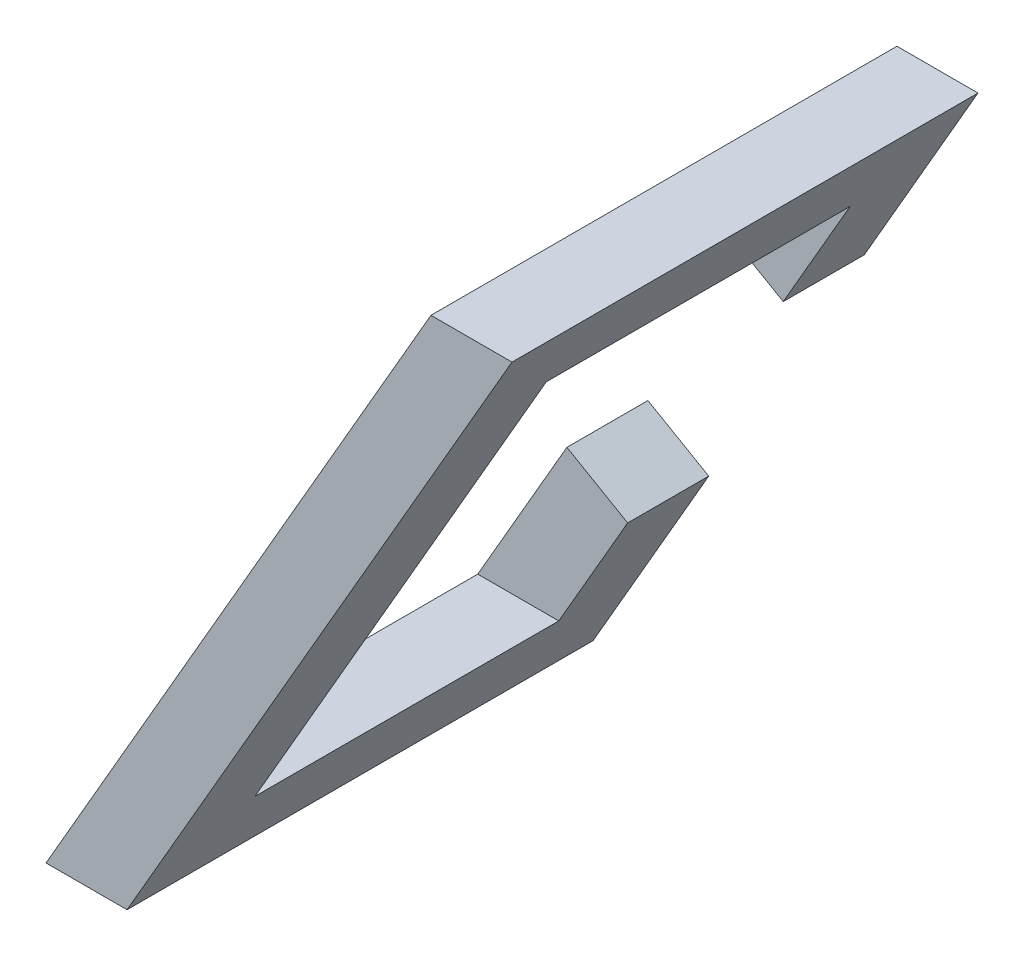
ISO-10303-21;
HEADER;
FILE_DESCRIPTION(('STEP AP214'),'2;1');
FILE_NAME('part.step','',(''),(''),'','','');
FILE_SCHEMA(('AUTOMOTIVE_DESIGN { 1 0 10303 214 1 1 1 1 }'));
ENDSEC;
DATA;
#1=APPLICATION_CONTEXT('core data for automotive mechanical design processes');
#2=APPLICATION_PROTOCOL_DEFINITION('international standard','automotive_design',2000,#1);
#3=PRODUCT_CONTEXT('',#1,'mechanical');
#4=PRODUCT('Part','Part','',(#3));
#5=PRODUCT_RELATED_PRODUCT_CATEGORY('part','',(#4));
#6=PRODUCT_DEFINITION_FORMATION('','',#4);
#7=PRODUCT_DEFINITION_CONTEXT('part definition',#1,'design');
#8=PRODUCT_DEFINITION('design','',#6,#7);
#9=PRODUCT_DEFINITION_SHAPE('','',#8);
#10=(LENGTH_UNIT() NAMED_UNIT(*) SI_UNIT(.MILLI.,.METRE.));
#11=(NAMED_UNIT(*) PLANE_ANGLE_UNIT() SI_UNIT($,.RADIAN.));
#12=(NAMED_UNIT(*) SI_UNIT($,.STERADIAN.) SOLID_ANGLE_UNIT());
#13=UNCERTAINTY_MEASURE_WITH_UNIT(LENGTH_MEASURE(1.E-05),#10,'distance_accuracy_value','');
#14=(GEOMETRIC_REPRESENTATION_CONTEXT(3) GLOBAL_UNCERTAINTY_ASSIGNED_CONTEXT((#13)) GLOBAL_UNIT_ASSIGNED_CONTEXT((#10,
#11,#12)) REPRESENTATION_CONTEXT('',''));
#15=CARTESIAN_POINT('',(0.,0.,0.));
#16=DIRECTION('',(0.,0.,1.));
#17=DIRECTION('',(1.,0.,0.));
#18=AXIS2_PLACEMENT_3D('',#15,#16,#17);
#19=CARTESIAN_POINT('',(4.58257569495584,0.,2.));
#20=DIRECTION('',(0.,0.,1.));
#21=DIRECTION('',(1.,0.,0.));
#22=AXIS2_PLACEMENT_3D('',#19,#20,#21);
#23=PLANE('',#22);
#24=DIRECTION('',(0.866025403784439,-0.5,0.));
#25=VECTOR('',#24,1.);
#26=CARTESIAN_POINT('',(5.3502578182624,54.1316550845719,2.));
#27=LINE('',#26,#25);
#28=CARTESIAN_POINT('',(73.2739783593554,14.915876745811,2.));
#29=VERTEX_POINT('',#28);
#30=CARTESIAN_POINT('',(76.2739783593554,13.1838259382421,2.));
#31=VERTEX_POINT('',#30);
#32=EDGE_CURVE('E144',#29,#31,#27,.T.);
#33=ORIENTED_EDGE('',*,*,#32,.F.);
#34=DIRECTION('',(-0.5,-0.866025403784439,0.));
#35=VECTOR('',#34,1.);
#36=CARTESIAN_POINT('',(85.5649607214573,36.2044826719044,2.));
#37=LINE('',#36,#35);
#38=CARTESIAN_POINT('',(68.8743617982158,7.2955173280957,2.));
#39=VERTEX_POINT('',#38);
#40=EDGE_CURVE('E48',#29,#39,#37,.T.);
#41=ORIENTED_EDGE('',*,*,#40,.T.);
#42=DIRECTION('',(-1.,0.,0.));
#43=VECTOR('',#42,1.);
#44=CARTESIAN_POINT('',(68.8743617982158,7.2955173280957,2.));
#45=LINE('',#44,#43);
#46=CARTESIAN_POINT('',(72.8743617982158,7.2955173280957,2.));
#47=VERTEX_POINT('',#46);
#48=EDGE_CURVE('E164',#47,#39,#45,.T.);
#49=ORIENTED_EDGE('',*,*,#48,.F.);
#50=DIRECTION('',(0.5,0.866025403784439,0.));
#51=VECTOR('',#50,1.);
#52=CARTESIAN_POINT('',(76.2255814313462,13.1,2.));
#53=LINE('',#52,#51);
#54=EDGE_CURVE('E209',#47,#31,#53,.T.);
#55=ORIENTED_EDGE('',*,*,#54,.T.);
#56=EDGE_LOOP('',(#33,#41,#49,#55));
#57=FACE_BOUND('',#56,.T.);
#58=ADVANCED_FACE('F33',(#57),#23,.T.);
#59=CARTESIAN_POINT('',(34.5825756949558,0.,-2.));
#60=DIRECTION('',(0.,0.,-1.));
#61=DIRECTION('',(-1.,0.,0.));
#62=AXIS2_PLACEMENT_3D('',#59,#60,#61);
#63=PLANE('',#62);
#64=DIRECTION('',(1.,0.,0.));
#65=VECTOR('',#64,1.);
#66=CARTESIAN_POINT('',(66.5649607214573,3.29551732809569,-2.));
#67=LINE('',#66,#65);
#68=CARTESIAN_POINT('',(66.5649607214573,3.29551732809569,-2.));
#69=VERTEX_POINT('',#68);
#70=CARTESIAN_POINT('',(70.5649607214573,3.29551732809569,-2.));
#71=VERTEX_POINT('',#70);
#72=EDGE_CURVE('E194',#69,#71,#67,.T.);
#73=ORIENTED_EDGE('',*,*,#72,.F.);
#74=DIRECTION('',(-0.5,-0.866025403784439,0.));
#75=VECTOR('',#74,1.);
#76=CARTESIAN_POINT('',(85.5649607214573,36.2044826719044,-2.));
#77=LINE('',#76,#75);
#78=CARTESIAN_POINT('',(73.2739783593554,14.915876745811,-2.00000000000001));
#79=VERTEX_POINT('',#78);
#80=EDGE_CURVE('E138',#79,#69,#77,.T.);
#81=ORIENTED_EDGE('',*,*,#80,.F.);
#82=DIRECTION('',(0.866025403784439,-0.5,0.));
#83=VECTOR('',#82,1.);
#84=CARTESIAN_POINT('',(67.613724321511,18.1838259382421,-2.00000000000001));
#85=LINE('',#84,#83);
#86=CARTESIAN_POINT('',(76.2739783593554,13.1838259382421,-2.00000000000001));
#87=VERTEX_POINT('',#86);
#88=EDGE_CURVE('E136',#79,#87,#85,.T.);
#89=ORIENTED_EDGE('',*,*,#88,.T.);
#90=DIRECTION('',(0.5,0.866025403784439,0.));
#91=VECTOR('',#90,1.);
#92=CARTESIAN_POINT('',(76.2255814313462,13.1,-2.));
#93=LINE('',#92,#91);
#94=EDGE_CURVE('E41',#71,#87,#93,.T.);
#95=ORIENTED_EDGE('',*,*,#94,.F.);
#96=EDGE_LOOP('',(#73,#81,#89,#95));
#97=FACE_BOUND('',#96,.T.);
#98=ADVANCED_FACE('F137',(#97),#63,.T.);
#99=CARTESIAN_POINT('',(5.3502578182624,54.1316550845719,-10.1));
#100=DIRECTION('',(-0.5,-0.866025403784439,0.));
#101=DIRECTION('',(0.866025403784439,-0.5,0.));
#102=AXIS2_PLACEMENT_3D('',#99,#100,#101);
#103=PLANE('',#102);
#104=DIRECTION('',(0.,0.,-1.));
#105=VECTOR('',#104,1.);
#106=CARTESIAN_POINT('',(76.2739783593554,13.1838259382421,-10.1));
#107=LINE('',#106,#105);
#108=EDGE_CURVE('E126',#31,#87,#107,.T.);
#109=ORIENTED_EDGE('',*,*,#108,.T.);
#110=ORIENTED_EDGE('',*,*,#88,.F.);
#111=DIRECTION('',(0.,0.,-1.));
#112=VECTOR('',#111,1.);
#113=CARTESIAN_POINT('',(73.2739783593554,14.915876745811,-10.1));
#114=LINE('',#113,#112);
#115=EDGE_CURVE('E140',#29,#79,#114,.T.);
#116=ORIENTED_EDGE('',*,*,#115,.F.);
#117=ORIENTED_EDGE('',*,*,#32,.T.);
#118=EDGE_LOOP('',(#109,#110,#116,#117));
#119=FACE_BOUND('',#118,.T.);
#120=ADVANCED_FACE('F142',(#119),#103,.F.);
#121=DIRECTION('',(0.866025403784439,-0.5,0.));
#122=VECTOR('',#121,1.);
#123=CARTESIAN_POINT('',(58.3929490320727,41.2407763670697,-2.00000000000001));
#124=LINE('',#123,#122);
#125=CARTESIAN_POINT('',(80.9527369395774,28.215876745811,-2.00000000000001));
#126=VERTEX_POINT('',#125);
#127=CARTESIAN_POINT('',(83.9527369395774,26.4838259382421,-2.00000000000001));
#128=VERTEX_POINT('',#127);
#129=EDGE_CURVE('E154',#126,#128,#124,.T.);
#130=ORIENTED_EDGE('',*,*,#129,.F.);
#131=CARTESIAN_POINT('',(85.5649607214573,36.2044826719044,-2.));
#132=VERTEX_POINT('',#131);
#133=EDGE_CURVE('E191',#132,#126,#77,.T.);
#134=ORIENTED_EDGE('',*,*,#133,.F.);
#135=DIRECTION('',(-1.,0.,0.));
#136=VECTOR('',#135,1.);
#137=CARTESIAN_POINT('',(85.5649607214573,36.2044826719044,-2.));
#138=LINE('',#137,#136);
#139=CARTESIAN_POINT('',(89.5649607214573,36.2044826719044,-2.));
#140=VERTEX_POINT('',#139);
#141=EDGE_CURVE('E196',#140,#132,#138,.T.);
#142=ORIENTED_EDGE('',*,*,#141,.F.);
#143=EDGE_CURVE('E133',#128,#140,#93,.T.);
#144=ORIENTED_EDGE('',*,*,#143,.F.);
#145=EDGE_LOOP('',(#130,#134,#142,#144));
#146=FACE_BOUND('',#145,.T.);
#147=ADVANCED_FACE('F230',(#146),#63,.T.);
#148=CARTESIAN_POINT('',(83.2555596446988,32.2044826719044,21.));
#149=DIRECTION('',(0.,1.,0.));
#150=DIRECTION('',(0.,0.,1.));
#151=AXIS2_PLACEMENT_3D('',#148,#149,#150);
#152=PLANE('',#151);
#153=DIRECTION('',(1.,0.,0.));
#154=VECTOR('',#153,1.);
#155=CARTESIAN_POINT('',(83.2555596446988,32.2044826719044,17.));
#156=LINE('',#155,#154);
#157=CARTESIAN_POINT('',(83.2555596446988,32.2044826719044,17.));
#158=VERTEX_POINT('',#157);
#159=CARTESIAN_POINT('',(87.2555596446987,32.2044826719044,17.));
#160=VERTEX_POINT('',#159);
#161=EDGE_CURVE('E162',#158,#160,#156,.T.);
#162=ORIENTED_EDGE('',*,*,#161,.F.);
#163=DIRECTION('',(0.,0.,-1.));
#164=VECTOR('',#163,1.);
#165=CARTESIAN_POINT('',(83.2555596446988,32.2044826719044,21.));
#166=LINE('',#165,#164);
#167=CARTESIAN_POINT('',(83.2555596446988,32.2044826719044,2.));
#168=VERTEX_POINT('',#167);
#169=EDGE_CURVE('E189',#158,#168,#166,.T.);
#170=ORIENTED_EDGE('',*,*,#169,.T.);
#171=DIRECTION('',(1.,0.,0.));
#172=VECTOR('',#171,1.);
#173=CARTESIAN_POINT('',(83.2555596446988,32.2044826719044,2.));
#174=LINE('',#173,#172);
#175=CARTESIAN_POINT('',(87.2555596446987,32.2044826719044,2.));
#176=VERTEX_POINT('',#175);
#177=EDGE_CURVE('E174',#168,#176,#174,.T.);
#178=ORIENTED_EDGE('',*,*,#177,.T.);
#179=DIRECTION('',(0.,0.,-1.));
#180=VECTOR('',#179,1.);
#181=CARTESIAN_POINT('',(87.2555596446988,32.2044826719044,21.));
#182=LINE('',#181,#180);
#183=EDGE_CURVE('E184',#160,#176,#182,.T.);
#184=ORIENTED_EDGE('',*,*,#183,.F.);
#185=EDGE_LOOP('',(#162,#170,#178,#184));
#186=FACE_BOUND('',#185,.T.);
#187=ADVANCED_FACE('F221',(#186),#152,.F.);
#188=CARTESIAN_POINT('',(68.8743617982158,7.2955173280957,21.));
#189=DIRECTION('',(0.,-1.,0.));
#190=DIRECTION('',(0.,0.,-1.));
#191=AXIS2_PLACEMENT_3D('',#188,#189,#190);
#192=PLANE('',#191);
#193=DIRECTION('',(-1.,0.,0.));
#194=VECTOR('',#193,1.);
#195=CARTESIAN_POINT('',(68.8743617982158,7.2955173280957,17.));
#196=LINE('',#195,#194);
#197=CARTESIAN_POINT('',(72.8743617982158,7.2955173280957,17.));
#198=VERTEX_POINT('',#197);
#199=CARTESIAN_POINT('',(68.8743617982158,7.2955173280957,17.));
#200=VERTEX_POINT('',#199);
#201=EDGE_CURVE('E11',#198,#200,#196,.T.);
#202=ORIENTED_EDGE('',*,*,#201,.F.);
#203=DIRECTION('',(0.,0.,-1.));
#204=VECTOR('',#203,1.);
#205=CARTESIAN_POINT('',(72.8743617982158,7.2955173280957,21.));
#206=LINE('',#205,#204);
#207=EDGE_CURVE('E172',#198,#47,#206,.T.);
#208=ORIENTED_EDGE('',*,*,#207,.T.);
#209=ORIENTED_EDGE('',*,*,#48,.T.);
#210=DIRECTION('',(0.,0.,-1.));
#211=VECTOR('',#210,1.);
#212=CARTESIAN_POINT('',(68.8743617982158,7.2955173280957,21.));
#213=LINE('',#212,#211);
#214=EDGE_CURVE('E168',#200,#39,#213,.T.);
#215=ORIENTED_EDGE('',*,*,#214,.F.);
#216=EDGE_LOOP('',(#202,#208,#209,#215));
#217=FACE_BOUND('',#216,.T.);
#218=ADVANCED_FACE('F261',(#217),#192,.F.);
#219=DIRECTION('',(0.866025403784439,-0.5,0.));
#220=VECTOR('',#219,1.);
#221=CARTESIAN_POINT('',(13.0290163984844,67.4316550845719,2.));
#222=LINE('',#221,#220);
#223=CARTESIAN_POINT('',(80.9527369395774,28.215876745811,2.));
#224=VERTEX_POINT('',#223);
#225=CARTESIAN_POINT('',(83.9527369395774,26.4838259382421,2.));
#226=VERTEX_POINT('',#225);
#227=EDGE_CURVE('E56',#224,#226,#222,.T.);
#228=ORIENTED_EDGE('',*,*,#227,.T.);
#229=EDGE_CURVE('E205',#226,#176,#53,.T.);
#230=ORIENTED_EDGE('',*,*,#229,.T.);
#231=ORIENTED_EDGE('',*,*,#177,.F.);
#232=EDGE_CURVE('E200',#168,#224,#37,.T.);
#233=ORIENTED_EDGE('',*,*,#232,.T.);
#234=EDGE_LOOP('',(#228,#230,#231,#233));
#235=FACE_BOUND('',#234,.T.);
#236=ADVANCED_FACE('F35',(#235),#23,.T.);
#237=CARTESIAN_POINT('',(76.2255814313462,13.1,-2.));
#238=DIRECTION('',(0.866025403784439,-0.5,0.));
#239=DIRECTION('',(0.5,0.866025403784439,0.));
#240=AXIS2_PLACEMENT_3D('',#237,#238,#239);
#241=PLANE('',#240);
#242=ORIENTED_EDGE('',*,*,#108,.F.);
#243=ORIENTED_EDGE('',*,*,#54,.F.);
#244=ORIENTED_EDGE('',*,*,#207,.F.);
#245=DIRECTION('',(0.5,0.866025403784439,0.));
#246=VECTOR('',#245,1.);
#247=CARTESIAN_POINT('',(89.5649607214573,36.2044826719044,17.));
#248=LINE('',#247,#246);
#249=EDGE_CURVE('E159',#198,#160,#248,.T.);
#250=ORIENTED_EDGE('',*,*,#249,.T.);
#251=ORIENTED_EDGE('',*,*,#183,.T.);
#252=ORIENTED_EDGE('',*,*,#229,.F.);
#253=DIRECTION('',(0.,0.,1.));
#254=VECTOR('',#253,1.);
#255=CARTESIAN_POINT('',(83.9527369395774,26.4838259382421,-10.1));
#256=LINE('',#255,#254);
#257=EDGE_CURVE('E145',#128,#226,#256,.T.);
#258=ORIENTED_EDGE('',*,*,#257,.F.);
#259=ORIENTED_EDGE('',*,*,#143,.T.);
#260=DIRECTION('',(0.,0.,1.));
#261=VECTOR('',#260,1.);
#262=CARTESIAN_POINT('',(89.5649607214573,36.2044826719044,-2.));
#263=LINE('',#262,#261);
#264=CARTESIAN_POINT('',(89.5649607214573,36.2044826719044,21.));
#265=VERTEX_POINT('',#264);
#266=EDGE_CURVE('E206',#140,#265,#263,.T.);
#267=ORIENTED_EDGE('',*,*,#266,.T.);
#268=DIRECTION('',(0.499999999999998,0.86602540378444,0.));
#269=VECTOR('',#268,1.);
#270=CARTESIAN_POINT('',(89.5649607214573,36.2044826719044,21.));
#271=LINE('',#270,#269);
#272=CARTESIAN_POINT('',(70.5649607214573,3.29551732809569,21.));
#273=VERTEX_POINT('',#272);
#274=EDGE_CURVE('E178',#273,#265,#271,.T.);
#275=ORIENTED_EDGE('',*,*,#274,.F.);
#276=DIRECTION('',(0.,0.,1.));
#277=VECTOR('',#276,1.);
#278=CARTESIAN_POINT('',(70.5649607214573,3.29551732809569,-2.));
#279=LINE('',#278,#277);
#280=EDGE_CURVE('E129',#71,#273,#279,.T.);
#281=ORIENTED_EDGE('',*,*,#280,.F.);
#282=ORIENTED_EDGE('',*,*,#94,.T.);
#283=EDGE_LOOP('',(#242,#243,#244,#250,#251,#252,#258,#259,#267,#275,#281,#282));
#284=FACE_BOUND('',#283,.T.);
#285=ADVANCED_FACE('F123',(#284),#241,.T.);
#286=CARTESIAN_POINT('',(66.5649607214573,3.29551732809569,-2.));
#287=DIRECTION('',(0.,-1.,0.));
#288=DIRECTION('',(1.,0.,0.));
#289=AXIS2_PLACEMENT_3D('',#286,#287,#288);
#290=PLANE('',#289);
#291=DIRECTION('',(1.,0.,0.));
#292=VECTOR('',#291,1.);
#293=CARTESIAN_POINT('',(66.5649607214573,3.29551732809569,21.));
#294=LINE('',#293,#292);
#295=CARTESIAN_POINT('',(66.5649607214573,3.29551732809569,21.));
#296=VERTEX_POINT('',#295);
#297=EDGE_CURVE('E165',#296,#273,#294,.T.);
#298=ORIENTED_EDGE('',*,*,#297,.F.);
#299=DIRECTION('',(0.,0.,1.));
#300=VECTOR('',#299,1.);
#301=CARTESIAN_POINT('',(66.5649607214573,3.29551732809569,-2.));
#302=LINE('',#301,#300);
#303=EDGE_CURVE('E199',#69,#296,#302,.T.);
#304=ORIENTED_EDGE('',*,*,#303,.F.);
#305=ORIENTED_EDGE('',*,*,#72,.T.);
#306=ORIENTED_EDGE('',*,*,#280,.T.);
#307=EDGE_LOOP('',(#298,#304,#305,#306));
#308=FACE_BOUND('',#307,.T.);
#309=ADVANCED_FACE('F242',(#308),#290,.T.);
#310=CARTESIAN_POINT('',(85.5649607214573,36.2044826719044,-2.));
#311=DIRECTION('',(-0.866025403784439,0.5,0.));
#312=DIRECTION('',(-0.5,-0.866025403784439,0.));
#313=AXIS2_PLACEMENT_3D('',#310,#311,#312);
#314=PLANE('',#313);
#315=ORIENTED_EDGE('',*,*,#115,.T.);
#316=ORIENTED_EDGE('',*,*,#80,.T.);
#317=ORIENTED_EDGE('',*,*,#303,.T.);
#318=DIRECTION('',(-0.5,-0.866025403784439,0.));
#319=VECTOR('',#318,1.);
#320=CARTESIAN_POINT('',(85.5649607214573,36.2044826719044,21.));
#321=LINE('',#320,#319);
#322=CARTESIAN_POINT('',(85.5649607214573,36.2044826719044,21.));
#323=VERTEX_POINT('',#322);
#324=EDGE_CURVE('E175',#323,#296,#321,.T.);
#325=ORIENTED_EDGE('',*,*,#324,.F.);
#326=DIRECTION('',(0.,0.,1.));
#327=VECTOR('',#326,1.);
#328=CARTESIAN_POINT('',(85.5649607214573,36.2044826719044,-2.));
#329=LINE('',#328,#327);
#330=EDGE_CURVE('E203',#132,#323,#329,.T.);
#331=ORIENTED_EDGE('',*,*,#330,.F.);
#332=ORIENTED_EDGE('',*,*,#133,.T.);
#333=DIRECTION('',(0.,0.,-1.));
#334=VECTOR('',#333,1.);
#335=CARTESIAN_POINT('',(80.9527369395774,28.215876745811,-2.));
#336=LINE('',#335,#334);
#337=EDGE_CURVE('E151',#224,#126,#336,.T.);
#338=ORIENTED_EDGE('',*,*,#337,.F.);
#339=ORIENTED_EDGE('',*,*,#232,.F.);
#340=ORIENTED_EDGE('',*,*,#169,.F.);
#341=DIRECTION('',(-0.5,-0.866025403784439,0.));
#342=VECTOR('',#341,1.);
#343=CARTESIAN_POINT('',(85.5649607214573,36.2044826719044,17.));
#344=LINE('',#343,#342);
#345=EDGE_CURVE('E156',#158,#200,#344,.T.);
#346=ORIENTED_EDGE('',*,*,#345,.T.);
#347=ORIENTED_EDGE('',*,*,#214,.T.);
#348=ORIENTED_EDGE('',*,*,#40,.F.);
#349=EDGE_LOOP('',(#315,#316,#317,#325,#331,#332,#338,#339,#340,#346,#347,#348));
#350=FACE_BOUND('',#349,.T.);
#351=ADVANCED_FACE('F223',(#350),#314,.T.);
#352=CARTESIAN_POINT('',(85.5649607214573,36.2044826719044,-2.));
#353=DIRECTION('',(0.,1.,0.));
#354=DIRECTION('',(0.,0.,1.));
#355=AXIS2_PLACEMENT_3D('',#352,#353,#354);
#356=PLANE('',#355);
#357=DIRECTION('',(-1.,0.,0.));
#358=VECTOR('',#357,1.);
#359=CARTESIAN_POINT('',(85.5649607214573,36.2044826719044,21.));
#360=LINE('',#359,#358);
#361=EDGE_CURVE('E181',#265,#323,#360,.T.);
#362=ORIENTED_EDGE('',*,*,#361,.F.);
#363=ORIENTED_EDGE('',*,*,#266,.F.);
#364=ORIENTED_EDGE('',*,*,#141,.T.);
#365=ORIENTED_EDGE('',*,*,#330,.T.);
#366=EDGE_LOOP('',(#362,#363,#364,#365));
#367=FACE_BOUND('',#366,.T.);
#368=ADVANCED_FACE('F235',(#367),#356,.T.);
#369=CARTESIAN_POINT('',(0.,0.,21.));
#370=DIRECTION('',(0.,0.,1.));
#371=DIRECTION('',(1.,0.,0.));
#372=AXIS2_PLACEMENT_3D('',#369,#370,#371);
#373=PLANE('',#372);
#374=ORIENTED_EDGE('',*,*,#324,.T.);
#375=ORIENTED_EDGE('',*,*,#297,.T.);
#376=ORIENTED_EDGE('',*,*,#274,.T.);
#377=ORIENTED_EDGE('',*,*,#361,.T.);
#378=EDGE_LOOP('',(#374,#375,#376,#377));
#379=FACE_BOUND('',#378,.T.);
#380=ADVANCED_FACE('F238',(#379),#373,.T.);
#381=CARTESIAN_POINT('',(0.,0.,17.));
#382=DIRECTION('',(0.,0.,1.));
#383=DIRECTION('',(1.,0.,0.));
#384=AXIS2_PLACEMENT_3D('',#381,#382,#383);
#385=PLANE('',#384);
#386=ORIENTED_EDGE('',*,*,#345,.F.);
#387=ORIENTED_EDGE('',*,*,#161,.T.);
#388=ORIENTED_EDGE('',*,*,#249,.F.);
#389=ORIENTED_EDGE('',*,*,#201,.T.);
#390=EDGE_LOOP('',(#386,#387,#388,#389));
#391=FACE_BOUND('',#390,.T.);
#392=ADVANCED_FACE('F275',(#391),#385,.F.);
#393=CARTESIAN_POINT('',(13.0290163984844,67.4316550845719,-10.1));
#394=DIRECTION('',(0.5,0.866025403784439,0.));
#395=DIRECTION('',(-0.866025403784439,0.5,0.));
#396=AXIS2_PLACEMENT_3D('',#393,#394,#395);
#397=PLANE('',#396);
#398=ORIENTED_EDGE('',*,*,#129,.T.);
#399=ORIENTED_EDGE('',*,*,#257,.T.);
#400=ORIENTED_EDGE('',*,*,#227,.F.);
#401=ORIENTED_EDGE('',*,*,#337,.T.);
#402=EDGE_LOOP('',(#398,#399,#400,#401));
#403=FACE_BOUND('',#402,.T.);
#404=ADVANCED_FACE('F227',(#403),#397,.F.);
#405=CLOSED_SHELL('',(#58,#98,#120,#147,#187,#218,#236,#285,#309,#351,#368,#380,#392,#404));
#406=MANIFOLD_SOLID_BREP('B2',#405);
#407=ADVANCED_BREP_SHAPE_REPRESENTATION('',(#18,#406),#14);
#408=SHAPE_DEFINITION_REPRESENTATION(#9,#407);
ENDSEC;
END-ISO-10303-21;
